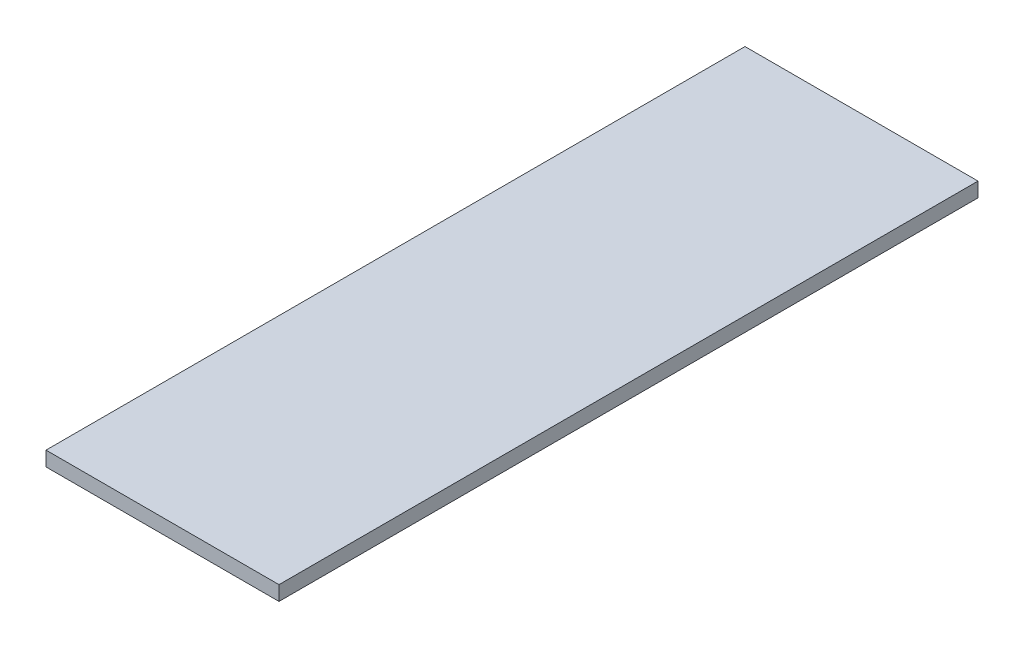
ISO-10303-21;
HEADER;
FILE_DESCRIPTION(('STEP AP214'),'2;1');
FILE_NAME('part.step','',(''),(''),'','','');
FILE_SCHEMA(('AUTOMOTIVE_DESIGN { 1 0 10303 214 1 1 1 1 }'));
ENDSEC;
DATA;
#1=APPLICATION_CONTEXT('core data for automotive mechanical design processes');
#2=APPLICATION_PROTOCOL_DEFINITION('international standard','automotive_design',2000,#1);
#3=PRODUCT_CONTEXT('',#1,'mechanical');
#4=PRODUCT('Part','Part','',(#3));
#5=PRODUCT_RELATED_PRODUCT_CATEGORY('part','',(#4));
#6=PRODUCT_DEFINITION_FORMATION('','',#4);
#7=PRODUCT_DEFINITION_CONTEXT('part definition',#1,'design');
#8=PRODUCT_DEFINITION('design','',#6,#7);
#9=PRODUCT_DEFINITION_SHAPE('','',#8);
#10=(LENGTH_UNIT() NAMED_UNIT(*) SI_UNIT(.MILLI.,.METRE.));
#11=(NAMED_UNIT(*) PLANE_ANGLE_UNIT() SI_UNIT($,.RADIAN.));
#12=(NAMED_UNIT(*) SI_UNIT($,.STERADIAN.) SOLID_ANGLE_UNIT());
#13=UNCERTAINTY_MEASURE_WITH_UNIT(LENGTH_MEASURE(1.E-05),#10,'distance_accuracy_value','');
#14=(GEOMETRIC_REPRESENTATION_CONTEXT(3) GLOBAL_UNCERTAINTY_ASSIGNED_CONTEXT((#13)) GLOBAL_UNIT_ASSIGNED_CONTEXT((#10,
#11,#12)) REPRESENTATION_CONTEXT('',''));
#15=CARTESIAN_POINT('',(0.,0.,0.));
#16=DIRECTION('',(0.,0.,1.));
#17=DIRECTION('',(1.,0.,0.));
#18=AXIS2_PLACEMENT_3D('',#15,#16,#17);
#19=CARTESIAN_POINT('',(6.35,0.79375,-19.05));
#20=DIRECTION('',(-1.,0.,0.));
#21=DIRECTION('',(0.,0.,1.));
#22=AXIS2_PLACEMENT_3D('',#19,#20,#21);
#23=PLANE('',#22);
#24=DIRECTION('',(0.,0.,-1.));
#25=VECTOR('',#24,1.);
#26=CARTESIAN_POINT('',(6.35,0.,-19.05));
#27=LINE('',#26,#25);
#28=CARTESIAN_POINT('',(6.35,0.,19.05));
#29=VERTEX_POINT('',#28);
#30=CARTESIAN_POINT('',(6.35,0.,-19.05));
#31=VERTEX_POINT('',#30);
#32=EDGE_CURVE('E98',#29,#31,#27,.T.);
#33=ORIENTED_EDGE('',*,*,#32,.T.);
#34=DIRECTION('',(0.,-1.,0.));
#35=VECTOR('',#34,1.);
#36=CARTESIAN_POINT('',(6.35,0.79375,-19.05));
#37=LINE('',#36,#35);
#38=CARTESIAN_POINT('',(6.35,0.79375,-19.05));
#39=VERTEX_POINT('',#38);
#40=EDGE_CURVE('E11',#39,#31,#37,.T.);
#41=ORIENTED_EDGE('',*,*,#40,.F.);
#42=DIRECTION('',(0.,0.,-1.));
#43=VECTOR('',#42,1.);
#44=CARTESIAN_POINT('',(6.35,0.79375,-19.05));
#45=LINE('',#44,#43);
#46=CARTESIAN_POINT('',(6.35,0.79375,19.05));
#47=VERTEX_POINT('',#46);
#48=EDGE_CURVE('E86',#47,#39,#45,.T.);
#49=ORIENTED_EDGE('',*,*,#48,.F.);
#50=DIRECTION('',(0.,-1.,0.));
#51=VECTOR('',#50,1.);
#52=CARTESIAN_POINT('',(6.35,0.79375,19.05));
#53=LINE('',#52,#51);
#54=EDGE_CURVE('E94',#47,#29,#53,.T.);
#55=ORIENTED_EDGE('',*,*,#54,.T.);
#56=EDGE_LOOP('',(#33,#41,#49,#55));
#57=FACE_BOUND('',#56,.T.);
#58=ADVANCED_FACE('F35',(#57),#23,.F.);
#59=CARTESIAN_POINT('',(-6.35,0.79375,-19.05));
#60=DIRECTION('',(0.,0.,1.));
#61=DIRECTION('',(1.,0.,0.));
#62=AXIS2_PLACEMENT_3D('',#59,#60,#61);
#63=PLANE('',#62);
#64=DIRECTION('',(-1.,0.,0.));
#65=VECTOR('',#64,1.);
#66=CARTESIAN_POINT('',(-6.35,0.,-19.05));
#67=LINE('',#66,#65);
#68=CARTESIAN_POINT('',(-6.35,0.,-19.05));
#69=VERTEX_POINT('',#68);
#70=EDGE_CURVE('E90',#31,#69,#67,.T.);
#71=ORIENTED_EDGE('',*,*,#70,.T.);
#72=DIRECTION('',(0.,-1.,0.));
#73=VECTOR('',#72,1.);
#74=CARTESIAN_POINT('',(-6.35,0.79375,-19.05));
#75=LINE('',#74,#73);
#76=CARTESIAN_POINT('',(-6.35,0.79375,-19.05));
#77=VERTEX_POINT('',#76);
#78=EDGE_CURVE('E43',#77,#69,#75,.T.);
#79=ORIENTED_EDGE('',*,*,#78,.F.);
#80=DIRECTION('',(-1.,0.,0.));
#81=VECTOR('',#80,1.);
#82=CARTESIAN_POINT('',(-6.35,0.79375,-19.05));
#83=LINE('',#82,#81);
#84=EDGE_CURVE('E81',#39,#77,#83,.T.);
#85=ORIENTED_EDGE('',*,*,#84,.F.);
#86=ORIENTED_EDGE('',*,*,#40,.T.);
#87=EDGE_LOOP('',(#71,#79,#85,#86));
#88=FACE_BOUND('',#87,.T.);
#89=ADVANCED_FACE('F89',(#88),#63,.F.);
#90=CARTESIAN_POINT('',(-6.35,0.79375,-19.05));
#91=DIRECTION('',(1.,0.,0.));
#92=DIRECTION('',(0.,0.,-1.));
#93=AXIS2_PLACEMENT_3D('',#90,#91,#92);
#94=PLANE('',#93);
#95=DIRECTION('',(0.,0.,1.));
#96=VECTOR('',#95,1.);
#97=CARTESIAN_POINT('',(-6.35,0.,-19.05));
#98=LINE('',#97,#96);
#99=CARTESIAN_POINT('',(-6.35,0.,19.05));
#100=VERTEX_POINT('',#99);
#101=EDGE_CURVE('E68',#69,#100,#98,.T.);
#102=ORIENTED_EDGE('',*,*,#101,.T.);
#103=DIRECTION('',(0.,-1.,0.));
#104=VECTOR('',#103,1.);
#105=CARTESIAN_POINT('',(-6.35,0.79375,19.05));
#106=LINE('',#105,#104);
#107=CARTESIAN_POINT('',(-6.35,0.79375,19.05));
#108=VERTEX_POINT('',#107);
#109=EDGE_CURVE('E91',#108,#100,#106,.T.);
#110=ORIENTED_EDGE('',*,*,#109,.F.);
#111=DIRECTION('',(0.,0.,1.));
#112=VECTOR('',#111,1.);
#113=CARTESIAN_POINT('',(-6.35,0.79375,-19.05));
#114=LINE('',#113,#112);
#115=EDGE_CURVE('E84',#77,#108,#114,.T.);
#116=ORIENTED_EDGE('',*,*,#115,.F.);
#117=ORIENTED_EDGE('',*,*,#78,.T.);
#118=EDGE_LOOP('',(#102,#110,#116,#117));
#119=FACE_BOUND('',#118,.T.);
#120=ADVANCED_FACE('F92',(#119),#94,.F.);
#121=CARTESIAN_POINT('',(-6.35,0.79375,19.05));
#122=DIRECTION('',(0.,0.,-1.));
#123=DIRECTION('',(-1.,0.,0.));
#124=AXIS2_PLACEMENT_3D('',#121,#122,#123);
#125=PLANE('',#124);
#126=DIRECTION('',(1.,0.,0.));
#127=VECTOR('',#126,1.);
#128=CARTESIAN_POINT('',(-6.35,0.,19.05));
#129=LINE('',#128,#127);
#130=EDGE_CURVE('E74',#100,#29,#129,.T.);
#131=ORIENTED_EDGE('',*,*,#130,.T.);
#132=ORIENTED_EDGE('',*,*,#54,.F.);
#133=DIRECTION('',(1.,0.,0.));
#134=VECTOR('',#133,1.);
#135=CARTESIAN_POINT('',(-6.35,0.79375,19.05));
#136=LINE('',#135,#134);
#137=EDGE_CURVE('E51',#108,#47,#136,.T.);
#138=ORIENTED_EDGE('',*,*,#137,.F.);
#139=ORIENTED_EDGE('',*,*,#109,.T.);
#140=EDGE_LOOP('',(#131,#132,#138,#139));
#141=FACE_BOUND('',#140,.T.);
#142=ADVANCED_FACE('F105',(#141),#125,.F.);
#143=CARTESIAN_POINT('',(0.,0.79375,0.));
#144=DIRECTION('',(0.,1.,0.));
#145=DIRECTION('',(0.,0.,1.));
#146=AXIS2_PLACEMENT_3D('',#143,#144,#145);
#147=PLANE('',#146);
#148=ORIENTED_EDGE('',*,*,#48,.T.);
#149=ORIENTED_EDGE('',*,*,#84,.T.);
#150=ORIENTED_EDGE('',*,*,#115,.T.);
#151=ORIENTED_EDGE('',*,*,#137,.T.);
#152=EDGE_LOOP('',(#148,#149,#150,#151));
#153=FACE_BOUND('',#152,.T.);
#154=ADVANCED_FACE('F82',(#153),#147,.T.);
#155=CARTESIAN_POINT('',(0.,0.,0.));
#156=DIRECTION('',(0.,1.,0.));
#157=DIRECTION('',(0.,0.,1.));
#158=AXIS2_PLACEMENT_3D('',#155,#156,#157);
#159=PLANE('',#158);
#160=ORIENTED_EDGE('',*,*,#32,.F.);
#161=ORIENTED_EDGE('',*,*,#130,.F.);
#162=ORIENTED_EDGE('',*,*,#101,.F.);
#163=ORIENTED_EDGE('',*,*,#70,.F.);
#164=EDGE_LOOP('',(#160,#161,#162,#163));
#165=FACE_BOUND('',#164,.T.);
#166=ADVANCED_FACE('F108',(#165),#159,.F.);
#167=CLOSED_SHELL('',(#58,#89,#120,#142,#154,#166));
#168=MANIFOLD_SOLID_BREP('B2',#167);
#169=ADVANCED_BREP_SHAPE_REPRESENTATION('',(#18,#168),#14);
#170=SHAPE_DEFINITION_REPRESENTATION(#9,#169);
ENDSEC;
END-ISO-10303-21;
